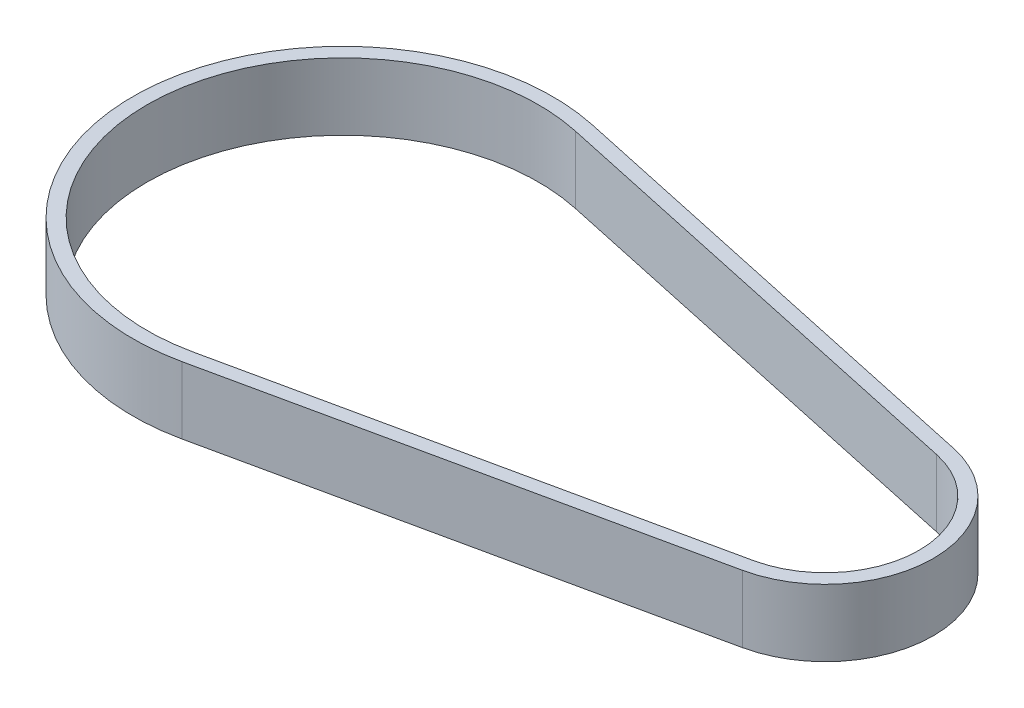
ISO-10303-21;
HEADER;
FILE_DESCRIPTION(('STEP AP214'),'2;1');
FILE_NAME('part.step','',(''),(''),'','','');
FILE_SCHEMA(('AUTOMOTIVE_DESIGN { 1 0 10303 214 1 1 1 1 }'));
ENDSEC;
DATA;
#1=APPLICATION_CONTEXT('core data for automotive mechanical design processes');
#2=APPLICATION_PROTOCOL_DEFINITION('international standard','automotive_design',2000,#1);
#3=PRODUCT_CONTEXT('',#1,'mechanical');
#4=PRODUCT('Part','Part','',(#3));
#5=PRODUCT_RELATED_PRODUCT_CATEGORY('part','',(#4));
#6=PRODUCT_DEFINITION_FORMATION('','',#4);
#7=PRODUCT_DEFINITION_CONTEXT('part definition',#1,'design');
#8=PRODUCT_DEFINITION('design','',#6,#7);
#9=PRODUCT_DEFINITION_SHAPE('','',#8);
#10=(LENGTH_UNIT() NAMED_UNIT(*) SI_UNIT(.MILLI.,.METRE.));
#11=(NAMED_UNIT(*) PLANE_ANGLE_UNIT() SI_UNIT($,.RADIAN.));
#12=(NAMED_UNIT(*) SI_UNIT($,.STERADIAN.) SOLID_ANGLE_UNIT());
#13=UNCERTAINTY_MEASURE_WITH_UNIT(LENGTH_MEASURE(1.E-05),#10,'distance_accuracy_value','');
#14=(GEOMETRIC_REPRESENTATION_CONTEXT(3) GLOBAL_UNCERTAINTY_ASSIGNED_CONTEXT((#13)) GLOBAL_UNIT_ASSIGNED_CONTEXT((#10,
#11,#12)) REPRESENTATION_CONTEXT('',''));
#15=CARTESIAN_POINT('',(0.,0.,0.));
#16=DIRECTION('',(0.,0.,1.));
#17=DIRECTION('',(1.,0.,0.));
#18=AXIS2_PLACEMENT_3D('',#15,#16,#17);
#19=CARTESIAN_POINT('',(0.,25.,0.));
#20=DIRECTION('',(0.,1.,0.));
#21=DIRECTION('',(0.,0.,1.));
#22=AXIS2_PLACEMENT_3D('',#19,#20,#21);
#23=PLANE('',#22);
#24=CARTESIAN_POINT('',(0.,25.,0.));
#25=DIRECTION('',(0.,1.,0.));
#26=DIRECTION('',(0.,0.,1.));
#27=AXIS2_PLACEMENT_3D('',#24,#25,#26);
#28=CIRCLE('',#27,78.3);
#29=CARTESIAN_POINT('',(16.53,25.,-76.535280100095));
#30=VERTEX_POINT('',#29);
#31=CARTESIAN_POINT('',(16.53,25.,76.535280100095));
#32=VERTEX_POINT('',#31);
#33=EDGE_CURVE('E133',#30,#32,#28,.T.);
#34=ORIENTED_EDGE('',*,*,#33,.T.);
#35=DIRECTION('',(0.97746207024387,0.,-0.211111111111111));
#36=VECTOR('',#35,1.);
#37=CARTESIAN_POINT('',(16.53,25.,76.535280100095));
#38=LINE('',#37,#36);
#39=CARTESIAN_POINT('',(188.507777777778,25.,39.391721430828));
#40=VERTEX_POINT('',#39);
#41=EDGE_CURVE('E136',#32,#40,#38,.T.);
#42=ORIENTED_EDGE('',*,*,#41,.T.);
#43=CARTESIAN_POINT('',(180.,25.,0.));
#44=DIRECTION('',(0.,1.,0.));
#45=DIRECTION('',(0.,0.,1.));
#46=AXIS2_PLACEMENT_3D('',#43,#44,#45);
#47=CIRCLE('',#46,40.3);
#48=CARTESIAN_POINT('',(188.507777777778,25.,-39.391721430828));
#49=VERTEX_POINT('',#48);
#50=EDGE_CURVE('E139',#40,#49,#47,.T.);
#51=ORIENTED_EDGE('',*,*,#50,.T.);
#52=DIRECTION('',(-0.97746207024387,0.,-0.211111111111111));
#53=VECTOR('',#52,1.);
#54=CARTESIAN_POINT('',(16.53,25.,-76.535280100095));
#55=LINE('',#54,#53);
#56=EDGE_CURVE('E141',#49,#30,#55,.T.);
#57=ORIENTED_EDGE('',*,*,#56,.T.);
#58=EDGE_LOOP('',(#34,#42,#51,#57));
#59=FACE_BOUND('',#58,.T.);
#60=DIRECTION('',(0.97746207024387,0.,-0.211111111111111));
#61=VECTOR('',#60,1.);
#62=CARTESIAN_POINT('',(15.4111111111111,25.,71.3547311278025));
#63=LINE('',#62,#61);
#64=CARTESIAN_POINT('',(15.4111111111111,25.,71.3547311278025));
#65=VERTEX_POINT('',#64);
#66=CARTESIAN_POINT('',(187.388888888889,25.,34.2111724585354));
#67=VERTEX_POINT('',#66);
#68=EDGE_CURVE('E105',#65,#67,#63,.T.);
#69=ORIENTED_EDGE('',*,*,#68,.F.);
#70=CARTESIAN_POINT('',(0.,25.,0.));
#71=DIRECTION('',(0.,1.,0.));
#72=DIRECTION('',(0.,0.,1.));
#73=AXIS2_PLACEMENT_3D('',#70,#71,#72);
#74=CIRCLE('',#73,73.);
#75=CARTESIAN_POINT('',(15.4111111111111,25.,-71.3547311278025));
#76=VERTEX_POINT('',#75);
#77=EDGE_CURVE('E97',#76,#65,#74,.T.);
#78=ORIENTED_EDGE('',*,*,#77,.F.);
#79=DIRECTION('',(-0.97746207024387,0.,-0.211111111111111));
#80=VECTOR('',#79,1.);
#81=CARTESIAN_POINT('',(15.4111111111111,25.,-71.3547311278025));
#82=LINE('',#81,#80);
#83=CARTESIAN_POINT('',(187.388888888889,25.,-34.2111724585355));
#84=VERTEX_POINT('',#83);
#85=EDGE_CURVE('E119',#84,#76,#82,.T.);
#86=ORIENTED_EDGE('',*,*,#85,.F.);
#87=CARTESIAN_POINT('',(180.,25.,0.));
#88=DIRECTION('',(0.,1.,0.));
#89=DIRECTION('',(0.,0.,1.));
#90=AXIS2_PLACEMENT_3D('',#87,#88,#89);
#91=CIRCLE('',#90,35.);
#92=EDGE_CURVE('E117',#67,#84,#91,.T.);
#93=ORIENTED_EDGE('',*,*,#92,.F.);
#94=EDGE_LOOP('',(#69,#78,#86,#93));
#95=FACE_BOUND('',#94,.T.);
#96=ADVANCED_FACE('F32',(#59,#95),#23,.T.);
#97=CARTESIAN_POINT('',(0.,0.,0.));
#98=DIRECTION('',(0.,1.,0.));
#99=DIRECTION('',(0.,0.,1.));
#100=AXIS2_PLACEMENT_3D('',#97,#98,#99);
#101=PLANE('',#100);
#102=CARTESIAN_POINT('',(0.,0.,0.));
#103=DIRECTION('',(0.,1.,0.));
#104=DIRECTION('',(0.,0.,1.));
#105=AXIS2_PLACEMENT_3D('',#102,#103,#104);
#106=CIRCLE('',#105,78.3);
#107=CARTESIAN_POINT('',(16.53,0.,-76.535280100095));
#108=VERTEX_POINT('',#107);
#109=CARTESIAN_POINT('',(16.53,0.,76.535280100095));
#110=VERTEX_POINT('',#109);
#111=EDGE_CURVE('E113',#108,#110,#106,.T.);
#112=ORIENTED_EDGE('',*,*,#111,.F.);
#113=DIRECTION('',(-0.97746207024387,0.,-0.211111111111111));
#114=VECTOR('',#113,1.);
#115=CARTESIAN_POINT('',(16.53,0.,-76.535280100095));
#116=LINE('',#115,#114);
#117=CARTESIAN_POINT('',(188.507777777778,0.,-39.391721430828));
#118=VERTEX_POINT('',#117);
#119=EDGE_CURVE('E137',#118,#108,#116,.T.);
#120=ORIENTED_EDGE('',*,*,#119,.F.);
#121=CARTESIAN_POINT('',(180.,0.,0.));
#122=DIRECTION('',(0.,1.,0.));
#123=DIRECTION('',(0.,0.,1.));
#124=AXIS2_PLACEMENT_3D('',#121,#122,#123);
#125=CIRCLE('',#124,40.3);
#126=CARTESIAN_POINT('',(188.507777777778,0.,39.391721430828));
#127=VERTEX_POINT('',#126);
#128=EDGE_CURVE('E148',#127,#118,#125,.T.);
#129=ORIENTED_EDGE('',*,*,#128,.F.);
#130=DIRECTION('',(0.97746207024387,0.,-0.211111111111111));
#131=VECTOR('',#130,1.);
#132=CARTESIAN_POINT('',(16.53,0.,76.535280100095));
#133=LINE('',#132,#131);
#134=EDGE_CURVE('E146',#110,#127,#133,.T.);
#135=ORIENTED_EDGE('',*,*,#134,.F.);
#136=EDGE_LOOP('',(#112,#120,#129,#135));
#137=FACE_BOUND('',#136,.T.);
#138=CARTESIAN_POINT('',(0.,0.,0.));
#139=DIRECTION('',(0.,1.,0.));
#140=DIRECTION('',(0.,0.,1.));
#141=AXIS2_PLACEMENT_3D('',#138,#139,#140);
#142=CIRCLE('',#141,73.);
#143=CARTESIAN_POINT('',(15.4111111111111,0.,-71.3547311278025));
#144=VERTEX_POINT('',#143);
#145=CARTESIAN_POINT('',(15.4111111111111,0.,71.3547311278025));
#146=VERTEX_POINT('',#145);
#147=EDGE_CURVE('E55',#144,#146,#142,.T.);
#148=ORIENTED_EDGE('',*,*,#147,.T.);
#149=DIRECTION('',(0.97746207024387,0.,-0.211111111111111));
#150=VECTOR('',#149,1.);
#151=CARTESIAN_POINT('',(15.4111111111111,0.,71.3547311278025));
#152=LINE('',#151,#150);
#153=CARTESIAN_POINT('',(187.388888888889,0.,34.2111724585354));
#154=VERTEX_POINT('',#153);
#155=EDGE_CURVE('E112',#146,#154,#152,.T.);
#156=ORIENTED_EDGE('',*,*,#155,.T.);
#157=CARTESIAN_POINT('',(180.,0.,0.));
#158=DIRECTION('',(0.,1.,0.));
#159=DIRECTION('',(0.,0.,1.));
#160=AXIS2_PLACEMENT_3D('',#157,#158,#159);
#161=CIRCLE('',#160,35.);
#162=CARTESIAN_POINT('',(187.388888888889,0.,-34.2111724585354));
#163=VERTEX_POINT('',#162);
#164=EDGE_CURVE('E125',#154,#163,#161,.T.);
#165=ORIENTED_EDGE('',*,*,#164,.T.);
#166=DIRECTION('',(-0.97746207024387,0.,-0.211111111111111));
#167=VECTOR('',#166,1.);
#168=CARTESIAN_POINT('',(15.4111111111111,0.,-71.3547311278025));
#169=LINE('',#168,#167);
#170=EDGE_CURVE('E106',#163,#144,#169,.T.);
#171=ORIENTED_EDGE('',*,*,#170,.T.);
#172=EDGE_LOOP('',(#148,#156,#165,#171));
#173=FACE_BOUND('',#172,.T.);
#174=ADVANCED_FACE('F166',(#137,#173),#101,.F.);
#175=CARTESIAN_POINT('',(0.,25.,0.));
#176=DIRECTION('',(0.,-1.,0.));
#177=DIRECTION('',(0.,0.,-1.));
#178=AXIS2_PLACEMENT_3D('',#175,#176,#177);
#179=CYLINDRICAL_SURFACE('',#178,78.3);
#180=ORIENTED_EDGE('',*,*,#111,.T.);
#181=DIRECTION('',(0.,-1.,0.));
#182=VECTOR('',#181,1.);
#183=CARTESIAN_POINT('',(16.53,25.,76.535280100095));
#184=LINE('',#183,#182);
#185=EDGE_CURVE('E11',#32,#110,#184,.T.);
#186=ORIENTED_EDGE('',*,*,#185,.F.);
#187=ORIENTED_EDGE('',*,*,#33,.F.);
#188=DIRECTION('',(0.,-1.,0.));
#189=VECTOR('',#188,1.);
#190=CARTESIAN_POINT('',(16.53,25.,-76.535280100095));
#191=LINE('',#190,#189);
#192=EDGE_CURVE('E143',#30,#108,#191,.T.);
#193=ORIENTED_EDGE('',*,*,#192,.T.);
#194=EDGE_LOOP('',(#180,#186,#187,#193));
#195=FACE_BOUND('',#194,.T.);
#196=ADVANCED_FACE('F34',(#195),#179,.T.);
#197=CARTESIAN_POINT('',(16.53,25.,76.535280100095));
#198=DIRECTION('',(-0.211111111111111,0.,-0.97746207024387));
#199=DIRECTION('',(-0.97746207024387,0.,0.211111111111111));
#200=AXIS2_PLACEMENT_3D('',#197,#198,#199);
#201=PLANE('',#200);
#202=ORIENTED_EDGE('',*,*,#134,.T.);
#203=DIRECTION('',(0.,-1.,0.));
#204=VECTOR('',#203,1.);
#205=CARTESIAN_POINT('',(188.507777777778,25.,39.391721430828));
#206=LINE('',#205,#204);
#207=EDGE_CURVE('E40',#40,#127,#206,.T.);
#208=ORIENTED_EDGE('',*,*,#207,.F.);
#209=ORIENTED_EDGE('',*,*,#41,.F.);
#210=ORIENTED_EDGE('',*,*,#185,.T.);
#211=EDGE_LOOP('',(#202,#208,#209,#210));
#212=FACE_BOUND('',#211,.T.);
#213=ADVANCED_FACE('F176',(#212),#201,.F.);
#214=CARTESIAN_POINT('',(180.,25.,0.));
#215=DIRECTION('',(0.,-1.,0.));
#216=DIRECTION('',(0.,0.,-1.));
#217=AXIS2_PLACEMENT_3D('',#214,#215,#216);
#218=CYLINDRICAL_SURFACE('',#217,40.3);
#219=ORIENTED_EDGE('',*,*,#128,.T.);
#220=DIRECTION('',(0.,-1.,0.));
#221=VECTOR('',#220,1.);
#222=CARTESIAN_POINT('',(188.507777777778,25.,-39.391721430828));
#223=LINE('',#222,#221);
#224=EDGE_CURVE('E153',#49,#118,#223,.T.);
#225=ORIENTED_EDGE('',*,*,#224,.F.);
#226=ORIENTED_EDGE('',*,*,#50,.F.);
#227=ORIENTED_EDGE('',*,*,#207,.T.);
#228=EDGE_LOOP('',(#219,#225,#226,#227));
#229=FACE_BOUND('',#228,.T.);
#230=ADVANCED_FACE('F160',(#229),#218,.T.);
#231=CARTESIAN_POINT('',(16.53,25.,-76.535280100095));
#232=DIRECTION('',(-0.211111111111111,0.,0.97746207024387));
#233=DIRECTION('',(0.97746207024387,0.,0.211111111111111));
#234=AXIS2_PLACEMENT_3D('',#231,#232,#233);
#235=PLANE('',#234);
#236=ORIENTED_EDGE('',*,*,#119,.T.);
#237=ORIENTED_EDGE('',*,*,#192,.F.);
#238=ORIENTED_EDGE('',*,*,#56,.F.);
#239=ORIENTED_EDGE('',*,*,#224,.T.);
#240=EDGE_LOOP('',(#236,#237,#238,#239));
#241=FACE_BOUND('',#240,.T.);
#242=ADVANCED_FACE('F170',(#241),#235,.F.);
#243=CARTESIAN_POINT('',(0.,25.,0.));
#244=DIRECTION('',(0.,-1.,0.));
#245=DIRECTION('',(0.,0.,-1.));
#246=AXIS2_PLACEMENT_3D('',#243,#244,#245);
#247=CYLINDRICAL_SURFACE('',#246,73.);
#248=ORIENTED_EDGE('',*,*,#147,.F.);
#249=DIRECTION('',(0.,-1.,0.));
#250=VECTOR('',#249,1.);
#251=CARTESIAN_POINT('',(15.4111111111111,25.,-71.3547311278025));
#252=LINE('',#251,#250);
#253=EDGE_CURVE('E101',#76,#144,#252,.T.);
#254=ORIENTED_EDGE('',*,*,#253,.F.);
#255=ORIENTED_EDGE('',*,*,#77,.T.);
#256=DIRECTION('',(0.,-1.,0.));
#257=VECTOR('',#256,1.);
#258=CARTESIAN_POINT('',(15.4111111111111,25.,71.3547311278025));
#259=LINE('',#258,#257);
#260=EDGE_CURVE('E100',#65,#146,#259,.T.);
#261=ORIENTED_EDGE('',*,*,#260,.T.);
#262=EDGE_LOOP('',(#248,#254,#255,#261));
#263=FACE_BOUND('',#262,.T.);
#264=ADVANCED_FACE('F99',(#263),#247,.F.);
#265=CARTESIAN_POINT('',(15.4111111111111,25.,71.3547311278025));
#266=DIRECTION('',(-0.211111111111111,0.,-0.97746207024387));
#267=DIRECTION('',(-0.97746207024387,0.,0.211111111111111));
#268=AXIS2_PLACEMENT_3D('',#265,#266,#267);
#269=PLANE('',#268);
#270=ORIENTED_EDGE('',*,*,#155,.F.);
#271=ORIENTED_EDGE('',*,*,#260,.F.);
#272=ORIENTED_EDGE('',*,*,#68,.T.);
#273=DIRECTION('',(0.,-1.,0.));
#274=VECTOR('',#273,1.);
#275=CARTESIAN_POINT('',(187.388888888889,25.,34.2111724585354));
#276=LINE('',#275,#274);
#277=EDGE_CURVE('E114',#67,#154,#276,.T.);
#278=ORIENTED_EDGE('',*,*,#277,.T.);
#279=EDGE_LOOP('',(#270,#271,#272,#278));
#280=FACE_BOUND('',#279,.T.);
#281=ADVANCED_FACE('F109',(#280),#269,.T.);
#282=CARTESIAN_POINT('',(180.,25.,0.));
#283=DIRECTION('',(0.,-1.,0.));
#284=DIRECTION('',(0.,0.,-1.));
#285=AXIS2_PLACEMENT_3D('',#282,#283,#284);
#286=CYLINDRICAL_SURFACE('',#285,35.);
#287=ORIENTED_EDGE('',*,*,#164,.F.);
#288=ORIENTED_EDGE('',*,*,#277,.F.);
#289=ORIENTED_EDGE('',*,*,#92,.T.);
#290=DIRECTION('',(0.,-1.,0.));
#291=VECTOR('',#290,1.);
#292=CARTESIAN_POINT('',(187.388888888889,25.,-34.2111724585354));
#293=LINE('',#292,#291);
#294=EDGE_CURVE('E47',#84,#163,#293,.T.);
#295=ORIENTED_EDGE('',*,*,#294,.T.);
#296=EDGE_LOOP('',(#287,#288,#289,#295));
#297=FACE_BOUND('',#296,.T.);
#298=ADVANCED_FACE('F199',(#297),#286,.F.);
#299=CARTESIAN_POINT('',(15.4111111111111,25.,-71.3547311278025));
#300=DIRECTION('',(-0.211111111111111,0.,0.97746207024387));
#301=DIRECTION('',(0.97746207024387,0.,0.211111111111111));
#302=AXIS2_PLACEMENT_3D('',#299,#300,#301);
#303=PLANE('',#302);
#304=ORIENTED_EDGE('',*,*,#170,.F.);
#305=ORIENTED_EDGE('',*,*,#294,.F.);
#306=ORIENTED_EDGE('',*,*,#85,.T.);
#307=ORIENTED_EDGE('',*,*,#253,.T.);
#308=EDGE_LOOP('',(#304,#305,#306,#307));
#309=FACE_BOUND('',#308,.T.);
#310=ADVANCED_FACE('F203',(#309),#303,.T.);
#311=CLOSED_SHELL('',(#96,#174,#196,#213,#230,#242,#264,#281,#298,#310));
#312=MANIFOLD_SOLID_BREP('B2',#311);
#313=ADVANCED_BREP_SHAPE_REPRESENTATION('',(#18,#312),#14);
#314=SHAPE_DEFINITION_REPRESENTATION(#9,#313);
ENDSEC;
END-ISO-10303-21;
